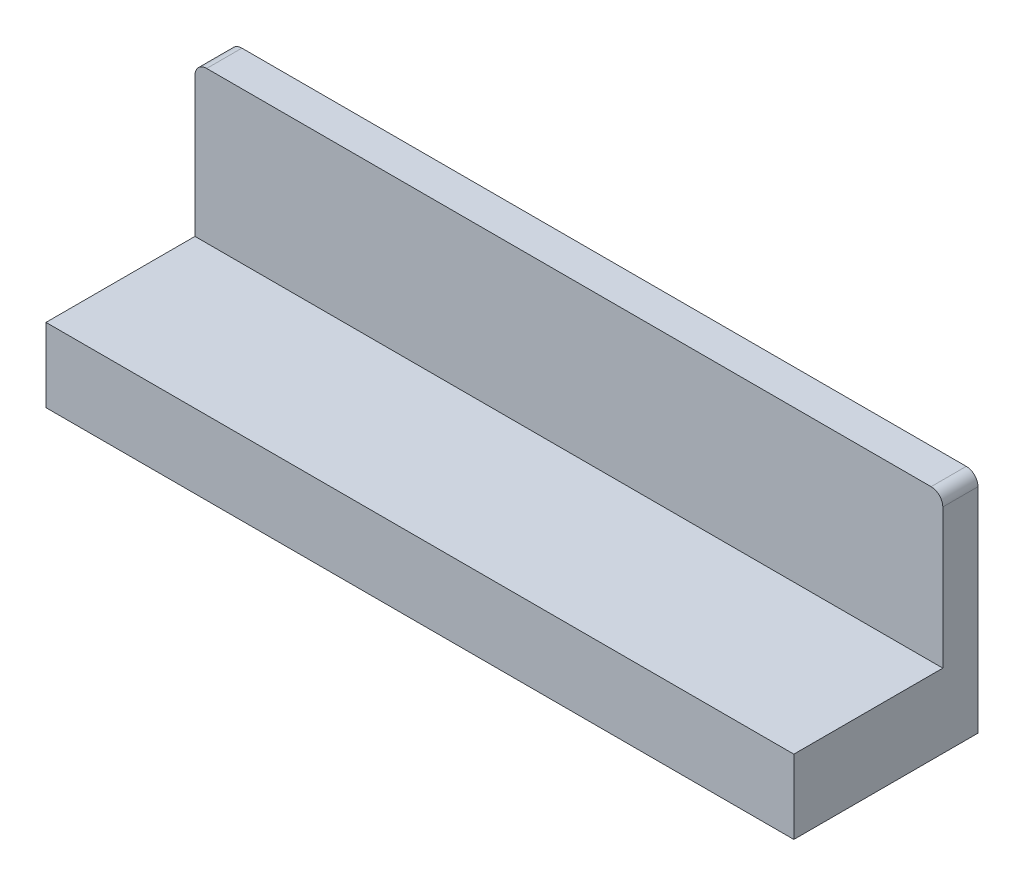
ISO-10303-21;
HEADER;
FILE_DESCRIPTION(('STEP AP214'),'2;1');
FILE_NAME('part.step','',(''),(''),'','','');
FILE_SCHEMA(('AUTOMOTIVE_DESIGN { 1 0 10303 214 1 1 1 1 }'));
ENDSEC;
DATA;
#1=APPLICATION_CONTEXT('core data for automotive mechanical design processes');
#2=APPLICATION_PROTOCOL_DEFINITION('international standard','automotive_design',2000,#1);
#3=PRODUCT_CONTEXT('',#1,'mechanical');
#4=PRODUCT('Part','Part','',(#3));
#5=PRODUCT_RELATED_PRODUCT_CATEGORY('part','',(#4));
#6=PRODUCT_DEFINITION_FORMATION('','',#4);
#7=PRODUCT_DEFINITION_CONTEXT('part definition',#1,'design');
#8=PRODUCT_DEFINITION('design','',#6,#7);
#9=PRODUCT_DEFINITION_SHAPE('','',#8);
#10=(LENGTH_UNIT() NAMED_UNIT(*) SI_UNIT(.MILLI.,.METRE.));
#11=(NAMED_UNIT(*) PLANE_ANGLE_UNIT() SI_UNIT($,.RADIAN.));
#12=(NAMED_UNIT(*) SI_UNIT($,.STERADIAN.) SOLID_ANGLE_UNIT());
#13=UNCERTAINTY_MEASURE_WITH_UNIT(LENGTH_MEASURE(1.E-05),#10,'distance_accuracy_value','');
#14=(GEOMETRIC_REPRESENTATION_CONTEXT(3) GLOBAL_UNCERTAINTY_ASSIGNED_CONTEXT((#13)) GLOBAL_UNIT_ASSIGNED_CONTEXT((#10,
#11,#12)) REPRESENTATION_CONTEXT('',''));
#15=CARTESIAN_POINT('',(0.,0.,0.));
#16=DIRECTION('',(0.,0.,1.));
#17=DIRECTION('',(1.,0.,0.));
#18=AXIS2_PLACEMENT_3D('',#15,#16,#17);
#19=CARTESIAN_POINT('',(-31.88,0.,0.));
#20=DIRECTION('',(0.,-1.,0.));
#21=DIRECTION('',(0.,0.,-1.));
#22=AXIS2_PLACEMENT_3D('',#19,#20,#21);
#23=PLANE('',#22);
#24=DIRECTION('',(0.,0.,-1.));
#25=VECTOR('',#24,1.);
#26=CARTESIAN_POINT('',(0.,0.,0.));
#27=LINE('',#26,#25);
#28=CARTESIAN_POINT('',(0.,0.,7.85));
#29=VERTEX_POINT('',#28);
#30=CARTESIAN_POINT('',(0.,0.,0.));
#31=VERTEX_POINT('',#30);
#32=EDGE_CURVE('E169',#29,#31,#27,.T.);
#33=ORIENTED_EDGE('',*,*,#32,.F.);
#34=DIRECTION('',(1.,0.,0.));
#35=VECTOR('',#34,1.);
#36=CARTESIAN_POINT('',(-31.88,0.,7.85));
#37=LINE('',#36,#35);
#38=CARTESIAN_POINT('',(-31.88,0.,7.85));
#39=VERTEX_POINT('',#38);
#40=EDGE_CURVE('E195',#39,#29,#37,.T.);
#41=ORIENTED_EDGE('',*,*,#40,.F.);
#42=DIRECTION('',(0.,0.,-1.));
#43=VECTOR('',#42,1.);
#44=CARTESIAN_POINT('',(-31.88,0.,0.));
#45=LINE('',#44,#43);
#46=CARTESIAN_POINT('',(-31.88,0.,0.));
#47=VERTEX_POINT('',#46);
#48=EDGE_CURVE('E177',#39,#47,#45,.T.);
#49=ORIENTED_EDGE('',*,*,#48,.T.);
#50=DIRECTION('',(1.,0.,0.));
#51=VECTOR('',#50,1.);
#52=CARTESIAN_POINT('',(-31.88,0.,0.));
#53=LINE('',#52,#51);
#54=EDGE_CURVE('E192',#47,#31,#53,.T.);
#55=ORIENTED_EDGE('',*,*,#54,.T.);
#56=EDGE_LOOP('',(#33,#41,#49,#55));
#57=FACE_BOUND('',#56,.T.);
#58=DIRECTION('',(1.,0.,0.));
#59=VECTOR('',#58,1.);
#60=CARTESIAN_POINT('',(-31.88,0.,6.35));
#61=LINE('',#60,#59);
#62=CARTESIAN_POINT('',(-30.38,0.,6.35));
#63=VERTEX_POINT('',#62);
#64=CARTESIAN_POINT('',(-1.5,0.,6.35));
#65=VERTEX_POINT('',#64);
#66=EDGE_CURVE('E146',#63,#65,#61,.T.);
#67=ORIENTED_EDGE('',*,*,#66,.T.);
#68=DIRECTION('',(0.,0.,-1.));
#69=VECTOR('',#68,1.);
#70=CARTESIAN_POINT('',(-1.5,0.,0.));
#71=LINE('',#70,#69);
#72=CARTESIAN_POINT('',(-1.5,0.,1.5));
#73=VERTEX_POINT('',#72);
#74=EDGE_CURVE('E150',#65,#73,#71,.T.);
#75=ORIENTED_EDGE('',*,*,#74,.T.);
#76=DIRECTION('',(1.,0.,0.));
#77=VECTOR('',#76,1.);
#78=CARTESIAN_POINT('',(-31.88,0.,1.5));
#79=LINE('',#78,#77);
#80=CARTESIAN_POINT('',(-30.38,0.,1.5));
#81=VERTEX_POINT('',#80);
#82=EDGE_CURVE('E159',#81,#73,#79,.T.);
#83=ORIENTED_EDGE('',*,*,#82,.F.);
#84=DIRECTION('',(0.,0.,-1.));
#85=VECTOR('',#84,1.);
#86=CARTESIAN_POINT('',(-30.38,0.,0.));
#87=LINE('',#86,#85);
#88=EDGE_CURVE('E50',#63,#81,#87,.T.);
#89=ORIENTED_EDGE('',*,*,#88,.F.);
#90=EDGE_LOOP('',(#67,#75,#83,#89));
#91=FACE_BOUND('',#90,.T.);
#92=ADVANCED_FACE('F35',(#57,#91),#23,.T.);
#93=CARTESIAN_POINT('',(-31.88,9.6,0.));
#94=DIRECTION('',(0.,0.,-1.));
#95=DIRECTION('',(-1.,0.,0.));
#96=AXIS2_PLACEMENT_3D('',#93,#94,#95);
#97=PLANE('',#96);
#98=DIRECTION('',(0.,1.,0.));
#99=VECTOR('',#98,1.);
#100=CARTESIAN_POINT('',(-31.88,9.6,0.));
#101=LINE('',#100,#99);
#102=CARTESIAN_POINT('',(-31.88,9.1,0.));
#103=VERTEX_POINT('',#102);
#104=EDGE_CURVE('E165',#47,#103,#101,.T.);
#105=ORIENTED_EDGE('',*,*,#104,.T.);
#106=CARTESIAN_POINT('',(-31.38,9.1,0.));
#107=DIRECTION('',(0.,0.,-1.));
#108=DIRECTION('',(-1.,0.,0.));
#109=AXIS2_PLACEMENT_3D('',#106,#107,#108);
#110=CIRCLE('',#109,0.5);
#111=CARTESIAN_POINT('',(-31.38,9.6,0.));
#112=VERTEX_POINT('',#111);
#113=EDGE_CURVE('E217',#103,#112,#110,.T.);
#114=ORIENTED_EDGE('',*,*,#113,.T.);
#115=DIRECTION('',(1.,0.,0.));
#116=VECTOR('',#115,1.);
#117=CARTESIAN_POINT('',(-31.88,9.6,0.));
#118=LINE('',#117,#116);
#119=CARTESIAN_POINT('',(-0.5,9.6,0.));
#120=VERTEX_POINT('',#119);
#121=EDGE_CURVE('E180',#112,#120,#118,.T.);
#122=ORIENTED_EDGE('',*,*,#121,.T.);
#123=CARTESIAN_POINT('',(-0.5,9.1,0.));
#124=DIRECTION('',(0.,0.,-1.));
#125=DIRECTION('',(-1.,0.,0.));
#126=AXIS2_PLACEMENT_3D('',#123,#124,#125);
#127=CIRCLE('',#126,0.5);
#128=CARTESIAN_POINT('',(0.,9.1,0.));
#129=VERTEX_POINT('',#128);
#130=EDGE_CURVE('E58',#120,#129,#127,.T.);
#131=ORIENTED_EDGE('',*,*,#130,.T.);
#132=DIRECTION('',(0.,1.,0.));
#133=VECTOR('',#132,1.);
#134=CARTESIAN_POINT('',(0.,9.6,0.));
#135=LINE('',#134,#133);
#136=EDGE_CURVE('E164',#31,#129,#135,.T.);
#137=ORIENTED_EDGE('',*,*,#136,.F.);
#138=ORIENTED_EDGE('',*,*,#54,.F.);
#139=EDGE_LOOP('',(#105,#114,#122,#131,#137,#138));
#140=FACE_BOUND('',#139,.T.);
#141=ADVANCED_FACE('F266',(#140),#97,.T.);
#142=CARTESIAN_POINT('',(-31.88,0.,7.85));
#143=DIRECTION('',(0.,0.,1.));
#144=DIRECTION('',(0.,-1.,0.));
#145=AXIS2_PLACEMENT_3D('',#142,#143,#144);
#146=PLANE('',#145);
#147=DIRECTION('',(0.,-1.,0.));
#148=VECTOR('',#147,1.);
#149=CARTESIAN_POINT('',(0.,0.,7.85));
#150=LINE('',#149,#148);
#151=CARTESIAN_POINT('',(0.,3.15,7.85));
#152=VERTEX_POINT('',#151);
#153=EDGE_CURVE('E187',#152,#29,#150,.T.);
#154=ORIENTED_EDGE('',*,*,#153,.F.);
#155=DIRECTION('',(1.,0.,0.));
#156=VECTOR('',#155,1.);
#157=CARTESIAN_POINT('',(-31.88,3.15,7.85));
#158=LINE('',#157,#156);
#159=CARTESIAN_POINT('',(-31.88,3.15,7.85));
#160=VERTEX_POINT('',#159);
#161=EDGE_CURVE('E197',#160,#152,#158,.T.);
#162=ORIENTED_EDGE('',*,*,#161,.F.);
#163=DIRECTION('',(0.,-1.,0.));
#164=VECTOR('',#163,1.);
#165=CARTESIAN_POINT('',(-31.88,0.,7.85));
#166=LINE('',#165,#164);
#167=EDGE_CURVE('E174',#160,#39,#166,.T.);
#168=ORIENTED_EDGE('',*,*,#167,.T.);
#169=ORIENTED_EDGE('',*,*,#40,.T.);
#170=EDGE_LOOP('',(#154,#162,#168,#169));
#171=FACE_BOUND('',#170,.T.);
#172=ADVANCED_FACE('F272',(#171),#146,.T.);
#173=CARTESIAN_POINT('',(-31.88,3.15,7.85));
#174=DIRECTION('',(0.,1.,0.));
#175=DIRECTION('',(0.,0.,1.));
#176=AXIS2_PLACEMENT_3D('',#173,#174,#175);
#177=PLANE('',#176);
#178=DIRECTION('',(0.,0.,1.));
#179=VECTOR('',#178,1.);
#180=CARTESIAN_POINT('',(0.,3.15,7.85));
#181=LINE('',#180,#179);
#182=CARTESIAN_POINT('',(0.,3.15,1.5));
#183=VERTEX_POINT('',#182);
#184=EDGE_CURVE('E184',#183,#152,#181,.T.);
#185=ORIENTED_EDGE('',*,*,#184,.F.);
#186=DIRECTION('',(1.,0.,0.));
#187=VECTOR('',#186,1.);
#188=CARTESIAN_POINT('',(-31.88,3.15,1.5));
#189=LINE('',#188,#187);
#190=CARTESIAN_POINT('',(-31.88,3.15,1.5));
#191=VERTEX_POINT('',#190);
#192=EDGE_CURVE('E199',#191,#183,#189,.T.);
#193=ORIENTED_EDGE('',*,*,#192,.F.);
#194=DIRECTION('',(0.,0.,1.));
#195=VECTOR('',#194,1.);
#196=CARTESIAN_POINT('',(-31.88,3.15,7.85));
#197=LINE('',#196,#195);
#198=EDGE_CURVE('E171',#191,#160,#197,.T.);
#199=ORIENTED_EDGE('',*,*,#198,.T.);
#200=ORIENTED_EDGE('',*,*,#161,.T.);
#201=EDGE_LOOP('',(#185,#193,#199,#200));
#202=FACE_BOUND('',#201,.T.);
#203=ADVANCED_FACE('F281',(#202),#177,.T.);
#204=CARTESIAN_POINT('',(-31.88,3.15,1.5));
#205=DIRECTION('',(0.,0.,1.));
#206=DIRECTION('',(0.,-1.,0.));
#207=AXIS2_PLACEMENT_3D('',#204,#205,#206);
#208=PLANE('',#207);
#209=DIRECTION('',(1.,0.,0.));
#210=VECTOR('',#209,1.);
#211=CARTESIAN_POINT('',(-31.88,9.6,1.5));
#212=LINE('',#211,#210);
#213=CARTESIAN_POINT('',(-31.38,9.6,1.5));
#214=VERTEX_POINT('',#213);
#215=CARTESIAN_POINT('',(-0.5,9.6,1.5));
#216=VERTEX_POINT('',#215);
#217=EDGE_CURVE('E202',#214,#216,#212,.T.);
#218=ORIENTED_EDGE('',*,*,#217,.F.);
#219=CARTESIAN_POINT('',(-31.38,9.1,1.5));
#220=DIRECTION('',(0.,0.,1.));
#221=DIRECTION('',(0.,-1.,0.));
#222=AXIS2_PLACEMENT_3D('',#219,#220,#221);
#223=CIRCLE('',#222,0.5);
#224=CARTESIAN_POINT('',(-31.88,9.1,1.5));
#225=VERTEX_POINT('',#224);
#226=EDGE_CURVE('E212',#214,#225,#223,.T.);
#227=ORIENTED_EDGE('',*,*,#226,.T.);
#228=DIRECTION('',(0.,-1.,0.));
#229=VECTOR('',#228,1.);
#230=CARTESIAN_POINT('',(-31.88,3.15,1.5));
#231=LINE('',#230,#229);
#232=EDGE_CURVE('E168',#225,#191,#231,.T.);
#233=ORIENTED_EDGE('',*,*,#232,.T.);
#234=ORIENTED_EDGE('',*,*,#192,.T.);
#235=DIRECTION('',(0.,-1.,0.));
#236=VECTOR('',#235,1.);
#237=CARTESIAN_POINT('',(0.,3.15,1.5));
#238=LINE('',#237,#236);
#239=CARTESIAN_POINT('',(0.,9.1,1.5));
#240=VERTEX_POINT('',#239);
#241=EDGE_CURVE('E182',#240,#183,#238,.T.);
#242=ORIENTED_EDGE('',*,*,#241,.F.);
#243=CARTESIAN_POINT('',(-0.5,9.1,1.5));
#244=DIRECTION('',(0.,0.,1.));
#245=DIRECTION('',(0.,-1.,0.));
#246=AXIS2_PLACEMENT_3D('',#243,#244,#245);
#247=CIRCLE('',#246,0.5);
#248=EDGE_CURVE('E210',#240,#216,#247,.T.);
#249=ORIENTED_EDGE('',*,*,#248,.T.);
#250=EDGE_LOOP('',(#218,#227,#233,#234,#242,#249));
#251=FACE_BOUND('',#250,.T.);
#252=ADVANCED_FACE('F285',(#251),#208,.T.);
#253=CARTESIAN_POINT('',(-31.88,9.6,1.5));
#254=DIRECTION('',(0.,1.,0.));
#255=DIRECTION('',(0.,0.,1.));
#256=AXIS2_PLACEMENT_3D('',#253,#254,#255);
#257=PLANE('',#256);
#258=ORIENTED_EDGE('',*,*,#121,.F.);
#259=DIRECTION('',(0.,0.,1.));
#260=VECTOR('',#259,1.);
#261=CARTESIAN_POINT('',(-31.38,9.6,1.5));
#262=LINE('',#261,#260);
#263=EDGE_CURVE('E207',#112,#214,#262,.T.);
#264=ORIENTED_EDGE('',*,*,#263,.T.);
#265=ORIENTED_EDGE('',*,*,#217,.T.);
#266=DIRECTION('',(0.,0.,1.));
#267=VECTOR('',#266,1.);
#268=CARTESIAN_POINT('',(-0.5,9.6,0.));
#269=LINE('',#268,#267);
#270=EDGE_CURVE('E194',#216,#120,#269,.F.);
#271=ORIENTED_EDGE('',*,*,#270,.T.);
#272=EDGE_LOOP('',(#258,#264,#265,#271));
#273=FACE_BOUND('',#272,.T.);
#274=ADVANCED_FACE('F289',(#273),#257,.T.);
#275=CARTESIAN_POINT('',(-31.88,0.,0.));
#276=DIRECTION('',(-1.,0.,0.));
#277=DIRECTION('',(0.,0.,1.));
#278=AXIS2_PLACEMENT_3D('',#275,#276,#277);
#279=PLANE('',#278);
#280=ORIENTED_EDGE('',*,*,#232,.F.);
#281=DIRECTION('',(0.,0.,1.));
#282=VECTOR('',#281,1.);
#283=CARTESIAN_POINT('',(-31.88,9.1,0.));
#284=LINE('',#283,#282);
#285=EDGE_CURVE('E214',#225,#103,#284,.F.);
#286=ORIENTED_EDGE('',*,*,#285,.T.);
#287=ORIENTED_EDGE('',*,*,#104,.F.);
#288=ORIENTED_EDGE('',*,*,#48,.F.);
#289=ORIENTED_EDGE('',*,*,#167,.F.);
#290=ORIENTED_EDGE('',*,*,#198,.F.);
#291=EDGE_LOOP('',(#280,#286,#287,#288,#289,#290));
#292=FACE_BOUND('',#291,.T.);
#293=ADVANCED_FACE('F292',(#292),#279,.T.);
#294=CARTESIAN_POINT('',(0.,0.,0.));
#295=DIRECTION('',(-1.,0.,0.));
#296=DIRECTION('',(0.,0.,1.));
#297=AXIS2_PLACEMENT_3D('',#294,#295,#296);
#298=PLANE('',#297);
#299=ORIENTED_EDGE('',*,*,#136,.T.);
#300=DIRECTION('',(0.,0.,1.));
#301=VECTOR('',#300,1.);
#302=CARTESIAN_POINT('',(0.,9.1,1.5));
#303=LINE('',#302,#301);
#304=EDGE_CURVE('E219',#129,#240,#303,.T.);
#305=ORIENTED_EDGE('',*,*,#304,.T.);
#306=ORIENTED_EDGE('',*,*,#241,.T.);
#307=ORIENTED_EDGE('',*,*,#184,.T.);
#308=ORIENTED_EDGE('',*,*,#153,.T.);
#309=ORIENTED_EDGE('',*,*,#32,.T.);
#310=EDGE_LOOP('',(#299,#305,#306,#307,#308,#309));
#311=FACE_BOUND('',#310,.T.);
#312=ADVANCED_FACE('F277',(#311),#298,.F.);
#313=CARTESIAN_POINT('',(-31.38,9.1,1.5));
#314=DIRECTION('',(0.,0.,1.));
#315=DIRECTION('',(0.,-1.,0.));
#316=AXIS2_PLACEMENT_3D('',#313,#314,#315);
#317=CYLINDRICAL_SURFACE('',#316,0.5);
#318=ORIENTED_EDGE('',*,*,#113,.F.);
#319=ORIENTED_EDGE('',*,*,#285,.F.);
#320=ORIENTED_EDGE('',*,*,#226,.F.);
#321=ORIENTED_EDGE('',*,*,#263,.F.);
#322=EDGE_LOOP('',(#318,#319,#320,#321));
#323=FACE_BOUND('',#322,.T.);
#324=ADVANCED_FACE('F294',(#323),#317,.T.);
#325=CARTESIAN_POINT('',(-0.5,9.1,0.));
#326=DIRECTION('',(0.,0.,-1.));
#327=DIRECTION('',(0.,1.,0.));
#328=AXIS2_PLACEMENT_3D('',#325,#326,#327);
#329=CYLINDRICAL_SURFACE('',#328,0.5);
#330=ORIENTED_EDGE('',*,*,#130,.F.);
#331=ORIENTED_EDGE('',*,*,#270,.F.);
#332=ORIENTED_EDGE('',*,*,#248,.F.);
#333=ORIENTED_EDGE('',*,*,#304,.F.);
#334=EDGE_LOOP('',(#330,#331,#332,#333));
#335=FACE_BOUND('',#334,.T.);
#336=ADVANCED_FACE('F37',(#335),#329,.T.);
#337=CARTESIAN_POINT('',(-31.88,9.6,1.5));
#338=DIRECTION('',(0.,0.,-1.));
#339=DIRECTION('',(-1.,0.,0.));
#340=AXIS2_PLACEMENT_3D('',#337,#338,#339);
#341=PLANE('',#340);
#342=DIRECTION('',(-1.,0.,0.));
#343=VECTOR('',#342,1.);
#344=CARTESIAN_POINT('',(-31.88,1.65,1.5));
#345=LINE('',#344,#343);
#346=CARTESIAN_POINT('',(-1.5,1.65,1.5));
#347=VERTEX_POINT('',#346);
#348=CARTESIAN_POINT('',(-30.38,1.65,1.5));
#349=VERTEX_POINT('',#348);
#350=EDGE_CURVE('E133',#347,#349,#345,.T.);
#351=ORIENTED_EDGE('',*,*,#350,.T.);
#352=DIRECTION('',(0.,1.,0.));
#353=VECTOR('',#352,1.);
#354=CARTESIAN_POINT('',(-30.38,9.6,1.5));
#355=LINE('',#354,#353);
#356=EDGE_CURVE('E153',#81,#349,#355,.T.);
#357=ORIENTED_EDGE('',*,*,#356,.F.);
#358=ORIENTED_EDGE('',*,*,#82,.T.);
#359=DIRECTION('',(0.,1.,0.));
#360=VECTOR('',#359,1.);
#361=CARTESIAN_POINT('',(-1.5,9.6,1.5));
#362=LINE('',#361,#360);
#363=EDGE_CURVE('E139',#73,#347,#362,.T.);
#364=ORIENTED_EDGE('',*,*,#363,.T.);
#365=EDGE_LOOP('',(#351,#357,#358,#364));
#366=FACE_BOUND('',#365,.T.);
#367=ADVANCED_FACE('F263',(#366),#341,.F.);
#368=CARTESIAN_POINT('',(-31.88,0.,6.35));
#369=DIRECTION('',(0.,0.,1.));
#370=DIRECTION('',(0.,-1.,0.));
#371=AXIS2_PLACEMENT_3D('',#368,#369,#370);
#372=PLANE('',#371);
#373=DIRECTION('',(0.,-1.,0.));
#374=VECTOR('',#373,1.);
#375=CARTESIAN_POINT('',(-1.5,0.,6.35));
#376=LINE('',#375,#374);
#377=CARTESIAN_POINT('',(-1.5,1.65,6.35));
#378=VERTEX_POINT('',#377);
#379=EDGE_CURVE('E138',#378,#65,#376,.T.);
#380=ORIENTED_EDGE('',*,*,#379,.T.);
#381=ORIENTED_EDGE('',*,*,#66,.F.);
#382=DIRECTION('',(0.,-1.,0.));
#383=VECTOR('',#382,1.);
#384=CARTESIAN_POINT('',(-30.38,0.,6.35));
#385=LINE('',#384,#383);
#386=CARTESIAN_POINT('',(-30.38,1.65,6.35));
#387=VERTEX_POINT('',#386);
#388=EDGE_CURVE('E144',#387,#63,#385,.T.);
#389=ORIENTED_EDGE('',*,*,#388,.F.);
#390=DIRECTION('',(1.,0.,0.));
#391=VECTOR('',#390,1.);
#392=CARTESIAN_POINT('',(-31.88,1.65,6.35));
#393=LINE('',#392,#391);
#394=EDGE_CURVE('E131',#387,#378,#393,.T.);
#395=ORIENTED_EDGE('',*,*,#394,.T.);
#396=EDGE_LOOP('',(#380,#381,#389,#395));
#397=FACE_BOUND('',#396,.T.);
#398=ADVANCED_FACE('F142',(#397),#372,.F.);
#399=CARTESIAN_POINT('',(-31.88,1.65,7.85));
#400=DIRECTION('',(0.,1.,0.));
#401=DIRECTION('',(0.,0.,1.));
#402=AXIS2_PLACEMENT_3D('',#399,#400,#401);
#403=PLANE('',#402);
#404=CARTESIAN_POINT('',(-7.97,1.65,3.925));
#405=DIRECTION('',(0.,1.,0.));
#406=DIRECTION('',(0.,0.,1.));
#407=AXIS2_PLACEMENT_3D('',#404,#405,#406);
#408=CIRCLE('',#407,1.5);
#409=CARTESIAN_POINT('',(-7.97,1.65,5.425));
#410=VERTEX_POINT('',#409);
#411=EDGE_CURVE('E12',#410,#410,#408,.F.);
#412=ORIENTED_EDGE('',*,*,#411,.F.);
#413=EDGE_LOOP('',(#412));
#414=FACE_BOUND('',#413,.T.);
#415=CARTESIAN_POINT('',(-15.94,1.65,3.925));
#416=DIRECTION('',(0.,1.,0.));
#417=DIRECTION('',(0.,0.,1.));
#418=AXIS2_PLACEMENT_3D('',#415,#416,#417);
#419=CIRCLE('',#418,1.5);
#420=CARTESIAN_POINT('',(-15.94,1.65,5.425));
#421=VERTEX_POINT('',#420);
#422=EDGE_CURVE('E43',#421,#421,#419,.F.);
#423=ORIENTED_EDGE('',*,*,#422,.F.);
#424=EDGE_LOOP('',(#423));
#425=FACE_BOUND('',#424,.T.);
#426=CARTESIAN_POINT('',(-23.91,1.65,3.925));
#427=DIRECTION('',(0.,1.,0.));
#428=DIRECTION('',(0.,0.,1.));
#429=AXIS2_PLACEMENT_3D('',#426,#427,#428);
#430=CIRCLE('',#429,1.5);
#431=CARTESIAN_POINT('',(-23.91,1.65,5.425));
#432=VERTEX_POINT('',#431);
#433=EDGE_CURVE('E222',#432,#432,#430,.F.);
#434=ORIENTED_EDGE('',*,*,#433,.F.);
#435=EDGE_LOOP('',(#434));
#436=FACE_BOUND('',#435,.T.);
#437=DIRECTION('',(0.,0.,1.));
#438=VECTOR('',#437,1.);
#439=CARTESIAN_POINT('',(-1.5,1.65,7.85));
#440=LINE('',#439,#438);
#441=EDGE_CURVE('E127',#347,#378,#440,.T.);
#442=ORIENTED_EDGE('',*,*,#441,.T.);
#443=ORIENTED_EDGE('',*,*,#394,.F.);
#444=DIRECTION('',(0.,0.,1.));
#445=VECTOR('',#444,1.);
#446=CARTESIAN_POINT('',(-30.38,1.65,7.85));
#447=LINE('',#446,#445);
#448=EDGE_CURVE('E158',#349,#387,#447,.T.);
#449=ORIENTED_EDGE('',*,*,#448,.F.);
#450=ORIENTED_EDGE('',*,*,#350,.F.);
#451=EDGE_LOOP('',(#442,#443,#449,#450));
#452=FACE_BOUND('',#451,.T.);
#453=ADVANCED_FACE('F129',(#414,#425,#436,#452),#403,.F.);
#454=CARTESIAN_POINT('',(-30.38,0.,0.));
#455=DIRECTION('',(-1.,0.,0.));
#456=DIRECTION('',(0.,0.,1.));
#457=AXIS2_PLACEMENT_3D('',#454,#455,#456);
#458=PLANE('',#457);
#459=ORIENTED_EDGE('',*,*,#448,.T.);
#460=ORIENTED_EDGE('',*,*,#388,.T.);
#461=ORIENTED_EDGE('',*,*,#88,.T.);
#462=ORIENTED_EDGE('',*,*,#356,.T.);
#463=EDGE_LOOP('',(#459,#460,#461,#462));
#464=FACE_BOUND('',#463,.T.);
#465=ADVANCED_FACE('F232',(#464),#458,.F.);
#466=CARTESIAN_POINT('',(-1.5,0.,0.));
#467=DIRECTION('',(-1.,0.,0.));
#468=DIRECTION('',(0.,0.,1.));
#469=AXIS2_PLACEMENT_3D('',#466,#467,#468);
#470=PLANE('',#469);
#471=ORIENTED_EDGE('',*,*,#363,.F.);
#472=ORIENTED_EDGE('',*,*,#74,.F.);
#473=ORIENTED_EDGE('',*,*,#379,.F.);
#474=ORIENTED_EDGE('',*,*,#441,.F.);
#475=EDGE_LOOP('',(#471,#472,#473,#474));
#476=FACE_BOUND('',#475,.T.);
#477=ADVANCED_FACE('F148',(#476),#470,.T.);
#478=CARTESIAN_POINT('',(-23.91,-4.24264068711929,3.925));
#479=DIRECTION('',(0.,1.,0.));
#480=DIRECTION('',(0.,0.,1.));
#481=AXIS2_PLACEMENT_3D('',#478,#479,#480);
#482=CYLINDRICAL_SURFACE('',#481,1.5);
#483=ORIENTED_EDGE('',*,*,#433,.T.);
#484=EDGE_LOOP('',(#483));
#485=FACE_BOUND('',#484,.T.);
#486=CARTESIAN_POINT('',(-23.91,0.199999999999999,3.925));
#487=DIRECTION('',(0.,-1.,0.));
#488=DIRECTION('',(0.,0.,-1.));
#489=AXIS2_PLACEMENT_3D('',#486,#487,#488);
#490=CIRCLE('',#489,1.5);
#491=CARTESIAN_POINT('',(-23.91,0.199999999999999,2.425));
#492=VERTEX_POINT('',#491);
#493=EDGE_CURVE('E246',#492,#492,#490,.T.);
#494=ORIENTED_EDGE('',*,*,#493,.F.);
#495=EDGE_LOOP('',(#494));
#496=FACE_BOUND('',#495,.T.);
#497=ADVANCED_FACE('F239',(#485,#496),#482,.T.);
#498=CARTESIAN_POINT('',(-23.91,-4.24264068711929,3.925));
#499=DIRECTION('',(0.,1.,0.));
#500=DIRECTION('',(0.,0.,1.));
#501=AXIS2_PLACEMENT_3D('',#498,#499,#500);
#502=CYLINDRICAL_SURFACE('',#501,0.6);
#503=CARTESIAN_POINT('',(-23.91,1.65,3.925));
#504=DIRECTION('',(0.,-1.,0.));
#505=DIRECTION('',(0.,0.,-1.));
#506=AXIS2_PLACEMENT_3D('',#503,#504,#505);
#507=CIRCLE('',#506,0.6);
#508=CARTESIAN_POINT('',(-23.91,1.65,3.325));
#509=VERTEX_POINT('',#508);
#510=EDGE_CURVE('E248',#509,#509,#507,.T.);
#511=ORIENTED_EDGE('',*,*,#510,.F.);
#512=EDGE_LOOP('',(#511));
#513=FACE_BOUND('',#512,.T.);
#514=CARTESIAN_POINT('',(-23.91,0.199999999999999,3.925));
#515=DIRECTION('',(0.,-1.,0.));
#516=DIRECTION('',(0.,0.,-1.));
#517=AXIS2_PLACEMENT_3D('',#514,#515,#516);
#518=CIRCLE('',#517,0.6);
#519=CARTESIAN_POINT('',(-23.91,0.199999999999999,3.325));
#520=VERTEX_POINT('',#519);
#521=EDGE_CURVE('E252',#520,#520,#518,.T.);
#522=ORIENTED_EDGE('',*,*,#521,.T.);
#523=EDGE_LOOP('',(#522));
#524=FACE_BOUND('',#523,.T.);
#525=ADVANCED_FACE('F242',(#513,#524),#502,.F.);
#526=CARTESIAN_POINT('',(-31.88,0.2,0.));
#527=DIRECTION('',(0.,-1.,0.));
#528=DIRECTION('',(0.,0.,-1.));
#529=AXIS2_PLACEMENT_3D('',#526,#527,#528);
#530=PLANE('',#529);
#531=ORIENTED_EDGE('',*,*,#521,.F.);
#532=EDGE_LOOP('',(#531));
#533=FACE_BOUND('',#532,.T.);
#534=ORIENTED_EDGE('',*,*,#493,.T.);
#535=EDGE_LOOP('',(#534));
#536=FACE_BOUND('',#535,.T.);
#537=ADVANCED_FACE('F334',(#533,#536),#530,.T.);
#538=ORIENTED_EDGE('',*,*,#510,.T.);
#539=EDGE_LOOP('',(#538));
#540=FACE_BOUND('',#539,.T.);
#541=ADVANCED_FACE('F236',(#540),#403,.F.);
#542=CARTESIAN_POINT('',(-15.94,-4.24264068711929,3.925));
#543=DIRECTION('',(0.,1.,0.));
#544=DIRECTION('',(0.,0.,1.));
#545=AXIS2_PLACEMENT_3D('',#542,#543,#544);
#546=CYLINDRICAL_SURFACE('',#545,1.5);
#547=ORIENTED_EDGE('',*,*,#422,.T.);
#548=EDGE_LOOP('',(#547));
#549=FACE_BOUND('',#548,.T.);
#550=CARTESIAN_POINT('',(-15.94,0.199999999999999,3.925));
#551=DIRECTION('',(0.,-1.,0.));
#552=DIRECTION('',(0.,0.,-1.));
#553=AXIS2_PLACEMENT_3D('',#550,#551,#552);
#554=CIRCLE('',#553,1.5);
#555=CARTESIAN_POINT('',(-15.94,0.199999999999999,2.425));
#556=VERTEX_POINT('',#555);
#557=EDGE_CURVE('E260',#556,#556,#554,.T.);
#558=ORIENTED_EDGE('',*,*,#557,.F.);
#559=EDGE_LOOP('',(#558));
#560=FACE_BOUND('',#559,.T.);
#561=ADVANCED_FACE('F227',(#549,#560),#546,.T.);
#562=CARTESIAN_POINT('',(-15.94,-4.24264068711929,3.925));
#563=DIRECTION('',(0.,1.,0.));
#564=DIRECTION('',(0.,0.,1.));
#565=AXIS2_PLACEMENT_3D('',#562,#563,#564);
#566=CYLINDRICAL_SURFACE('',#565,0.600000000000002);
#567=CARTESIAN_POINT('',(-15.94,1.65,3.925));
#568=DIRECTION('',(0.,-1.,0.));
#569=DIRECTION('',(0.,0.,-1.));
#570=AXIS2_PLACEMENT_3D('',#567,#568,#569);
#571=CIRCLE('',#570,0.600000000000002);
#572=CARTESIAN_POINT('',(-15.94,1.65,3.325));
#573=VERTEX_POINT('',#572);
#574=EDGE_CURVE('E376',#573,#573,#571,.T.);
#575=ORIENTED_EDGE('',*,*,#574,.F.);
#576=EDGE_LOOP('',(#575));
#577=FACE_BOUND('',#576,.T.);
#578=CARTESIAN_POINT('',(-15.94,0.199999999999999,3.925));
#579=DIRECTION('',(0.,-1.,0.));
#580=DIRECTION('',(0.,0.,-1.));
#581=AXIS2_PLACEMENT_3D('',#578,#579,#580);
#582=CIRCLE('',#581,0.600000000000002);
#583=CARTESIAN_POINT('',(-15.94,0.199999999999999,3.325));
#584=VERTEX_POINT('',#583);
#585=EDGE_CURVE('E255',#584,#584,#582,.T.);
#586=ORIENTED_EDGE('',*,*,#585,.T.);
#587=EDGE_LOOP('',(#586));
#588=FACE_BOUND('',#587,.T.);
#589=ADVANCED_FACE('F341',(#577,#588),#566,.F.);
#590=CARTESIAN_POINT('',(-31.88,0.2,0.));
#591=DIRECTION('',(0.,-1.,0.));
#592=DIRECTION('',(0.,0.,-1.));
#593=AXIS2_PLACEMENT_3D('',#590,#591,#592);
#594=PLANE('',#593);
#595=ORIENTED_EDGE('',*,*,#585,.F.);
#596=EDGE_LOOP('',(#595));
#597=FACE_BOUND('',#596,.T.);
#598=ORIENTED_EDGE('',*,*,#557,.T.);
#599=EDGE_LOOP('',(#598));
#600=FACE_BOUND('',#599,.T.);
#601=ADVANCED_FACE('F344',(#597,#600),#594,.T.);
#602=ORIENTED_EDGE('',*,*,#574,.T.);
#603=EDGE_LOOP('',(#602));
#604=FACE_BOUND('',#603,.T.);
#605=ADVANCED_FACE('F348',(#604),#403,.F.);
#606=CARTESIAN_POINT('',(-7.97,-4.24264068711929,3.925));
#607=DIRECTION('',(0.,1.,0.));
#608=DIRECTION('',(0.,0.,1.));
#609=AXIS2_PLACEMENT_3D('',#606,#607,#608);
#610=CYLINDRICAL_SURFACE('',#609,1.5);
#611=ORIENTED_EDGE('',*,*,#411,.T.);
#612=EDGE_LOOP('',(#611));
#613=FACE_BOUND('',#612,.T.);
#614=CARTESIAN_POINT('',(-7.97,0.199999999999999,3.925));
#615=DIRECTION('',(0.,-1.,0.));
#616=DIRECTION('',(0.,0.,-1.));
#617=AXIS2_PLACEMENT_3D('',#614,#615,#616);
#618=CIRCLE('',#617,1.5);
#619=CARTESIAN_POINT('',(-7.97,0.199999999999999,2.425));
#620=VERTEX_POINT('',#619);
#621=EDGE_CURVE('E371',#620,#620,#618,.T.);
#622=ORIENTED_EDGE('',*,*,#621,.F.);
#623=EDGE_LOOP('',(#622));
#624=FACE_BOUND('',#623,.T.);
#625=ADVANCED_FACE('F350',(#613,#624),#610,.T.);
#626=CARTESIAN_POINT('',(-7.97,-4.24264068711929,3.925));
#627=DIRECTION('',(0.,1.,0.));
#628=DIRECTION('',(0.,0.,1.));
#629=AXIS2_PLACEMENT_3D('',#626,#627,#628);
#630=CYLINDRICAL_SURFACE('',#629,0.6);
#631=CARTESIAN_POINT('',(-7.97,1.65,3.925));
#632=DIRECTION('',(0.,-1.,0.));
#633=DIRECTION('',(0.,0.,-1.));
#634=AXIS2_PLACEMENT_3D('',#631,#632,#633);
#635=CIRCLE('',#634,0.6);
#636=CARTESIAN_POINT('',(-7.97,1.65,3.325));
#637=VERTEX_POINT('',#636);
#638=EDGE_CURVE('E373',#637,#637,#635,.T.);
#639=ORIENTED_EDGE('',*,*,#638,.F.);
#640=EDGE_LOOP('',(#639));
#641=FACE_BOUND('',#640,.T.);
#642=CARTESIAN_POINT('',(-7.97,0.199999999999999,3.925));
#643=DIRECTION('',(0.,-1.,0.));
#644=DIRECTION('',(0.,0.,-1.));
#645=AXIS2_PLACEMENT_3D('',#642,#643,#644);
#646=CIRCLE('',#645,0.6);
#647=CARTESIAN_POINT('',(-7.97,0.199999999999999,3.325));
#648=VERTEX_POINT('',#647);
#649=EDGE_CURVE('E368',#648,#648,#646,.T.);
#650=ORIENTED_EDGE('',*,*,#649,.T.);
#651=EDGE_LOOP('',(#650));
#652=FACE_BOUND('',#651,.T.);
#653=ADVANCED_FACE('F353',(#641,#652),#630,.F.);
#654=CARTESIAN_POINT('',(-31.88,0.2,0.));
#655=DIRECTION('',(0.,-1.,0.));
#656=DIRECTION('',(0.,0.,-1.));
#657=AXIS2_PLACEMENT_3D('',#654,#655,#656);
#658=PLANE('',#657);
#659=ORIENTED_EDGE('',*,*,#649,.F.);
#660=EDGE_LOOP('',(#659));
#661=FACE_BOUND('',#660,.T.);
#662=ORIENTED_EDGE('',*,*,#621,.T.);
#663=EDGE_LOOP('',(#662));
#664=FACE_BOUND('',#663,.T.);
#665=ADVANCED_FACE('F357',(#661,#664),#658,.T.);
#666=ORIENTED_EDGE('',*,*,#638,.T.);
#667=EDGE_LOOP('',(#666));
#668=FACE_BOUND('',#667,.T.);
#669=ADVANCED_FACE('F235',(#668),#403,.F.);
#670=CLOSED_SHELL('',(#92,#141,#172,#203,#252,#274,#293,#312,#324,#336,#367,#398,#453,#465,#477,
#497,#525,#537,#541,#561,#589,#601,#605,#625,#653,#665,#669));
#671=MANIFOLD_SOLID_BREP('B2',#670);
#672=ADVANCED_BREP_SHAPE_REPRESENTATION('',(#18,#671),#14);
#673=SHAPE_DEFINITION_REPRESENTATION(#9,#672);
ENDSEC;
END-ISO-10303-21;
